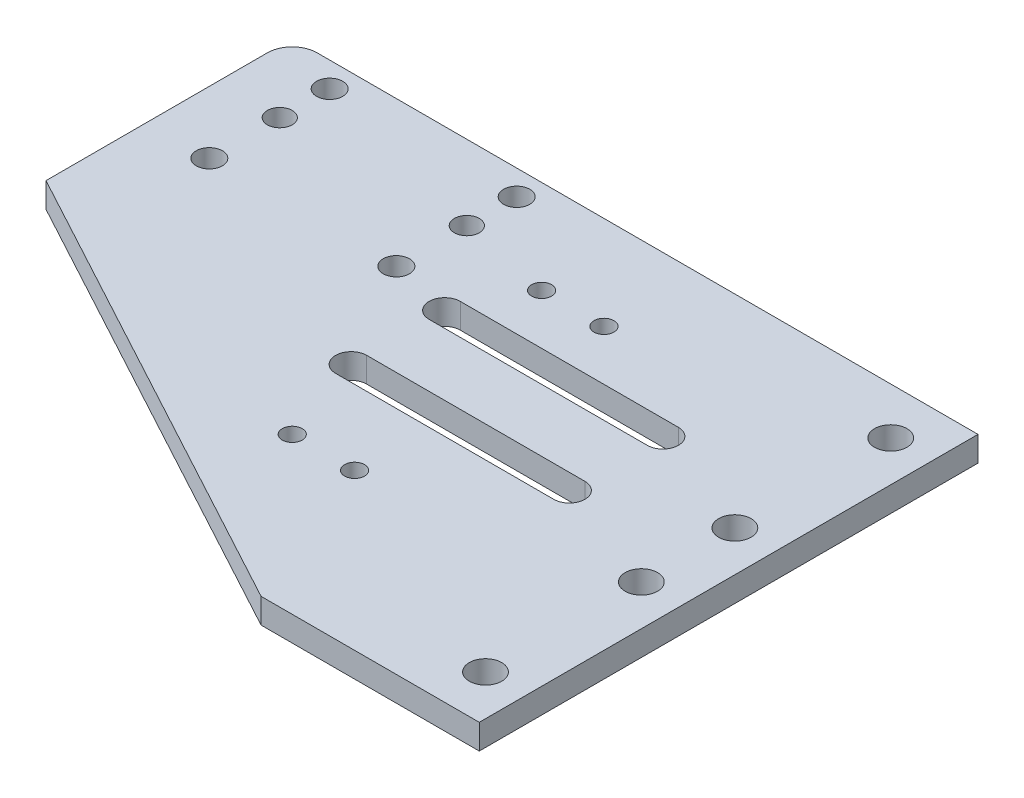
ISO-10303-21;
HEADER;
FILE_DESCRIPTION(('STEP AP214'),'2;1');
FILE_NAME('part.step','',(''),(''),'','','');
FILE_SCHEMA(('AUTOMOTIVE_DESIGN { 1 0 10303 214 1 1 1 1 }'));
ENDSEC;
DATA;
#1=APPLICATION_CONTEXT('core data for automotive mechanical design processes');
#2=APPLICATION_PROTOCOL_DEFINITION('international standard','automotive_design',2000,#1);
#3=PRODUCT_CONTEXT('',#1,'mechanical');
#4=PRODUCT('Part','Part','',(#3));
#5=PRODUCT_RELATED_PRODUCT_CATEGORY('part','',(#4));
#6=PRODUCT_DEFINITION_FORMATION('','',#4);
#7=PRODUCT_DEFINITION_CONTEXT('part definition',#1,'design');
#8=PRODUCT_DEFINITION('design','',#6,#7);
#9=PRODUCT_DEFINITION_SHAPE('','',#8);
#10=(LENGTH_UNIT() NAMED_UNIT(*) SI_UNIT(.MILLI.,.METRE.));
#11=(NAMED_UNIT(*) PLANE_ANGLE_UNIT() SI_UNIT($,.RADIAN.));
#12=(NAMED_UNIT(*) SI_UNIT($,.STERADIAN.) SOLID_ANGLE_UNIT());
#13=UNCERTAINTY_MEASURE_WITH_UNIT(LENGTH_MEASURE(1.E-05),#10,'distance_accuracy_value','');
#14=(GEOMETRIC_REPRESENTATION_CONTEXT(3) GLOBAL_UNCERTAINTY_ASSIGNED_CONTEXT((#13)) GLOBAL_UNIT_ASSIGNED_CONTEXT((#10,
#11,#12)) REPRESENTATION_CONTEXT('',''));
#15=CARTESIAN_POINT('',(0.,0.,0.));
#16=DIRECTION('',(0.,0.,1.));
#17=DIRECTION('',(1.,0.,0.));
#18=AXIS2_PLACEMENT_3D('',#15,#16,#17);
#19=CARTESIAN_POINT('',(0.,4.,0.));
#20=DIRECTION('',(1.,0.,0.));
#21=DIRECTION('',(0.,0.,-1.));
#22=AXIS2_PLACEMENT_3D('',#19,#20,#21);
#23=PLANE('',#22);
#24=DIRECTION('',(0.,0.,1.));
#25=VECTOR('',#24,1.);
#26=CARTESIAN_POINT('',(0.,0.,0.));
#27=LINE('',#26,#25);
#28=CARTESIAN_POINT('',(0.,0.,-76.));
#29=VERTEX_POINT('',#28);
#30=CARTESIAN_POINT('',(0.,0.,-40.5));
#31=VERTEX_POINT('',#30);
#32=EDGE_CURVE('E287',#29,#31,#27,.T.);
#33=ORIENTED_EDGE('',*,*,#32,.T.);
#34=DIRECTION('',(0.,-1.,0.));
#35=VECTOR('',#34,1.);
#36=CARTESIAN_POINT('',(0.,10.,-40.5));
#37=LINE('',#36,#35);
#38=CARTESIAN_POINT('',(0.,4.,-40.5));
#39=VERTEX_POINT('',#38);
#40=EDGE_CURVE('E232',#39,#31,#37,.T.);
#41=ORIENTED_EDGE('',*,*,#40,.F.);
#42=DIRECTION('',(0.,0.,1.));
#43=VECTOR('',#42,1.);
#44=CARTESIAN_POINT('',(0.,4.,0.));
#45=LINE('',#44,#43);
#46=CARTESIAN_POINT('',(0.,4.,-76.));
#47=VERTEX_POINT('',#46);
#48=EDGE_CURVE('E290',#47,#39,#45,.T.);
#49=ORIENTED_EDGE('',*,*,#48,.F.);
#50=DIRECTION('',(0.,-1.,0.));
#51=VECTOR('',#50,1.);
#52=CARTESIAN_POINT('',(0.,4.,-76.));
#53=LINE('',#52,#51);
#54=EDGE_CURVE('E315',#47,#29,#53,.T.);
#55=ORIENTED_EDGE('',*,*,#54,.T.);
#56=EDGE_LOOP('',(#33,#41,#49,#55));
#57=FACE_BOUND('',#56,.T.);
#58=ADVANCED_FACE('F34',(#57),#23,.F.);
#59=CARTESIAN_POINT('',(0.,4.,0.));
#60=DIRECTION('',(0.,0.,-1.));
#61=DIRECTION('',(-1.,0.,0.));
#62=AXIS2_PLACEMENT_3D('',#59,#60,#61);
#63=PLANE('',#62);
#64=DIRECTION('',(1.,0.,0.));
#65=VECTOR('',#64,1.);
#66=CARTESIAN_POINT('',(0.,4.,0.));
#67=LINE('',#66,#65);
#68=CARTESIAN_POINT('',(75.,4.,0.));
#69=VERTEX_POINT('',#68);
#70=CARTESIAN_POINT('',(110.,4.,0.));
#71=VERTEX_POINT('',#70);
#72=EDGE_CURVE('E293',#69,#71,#67,.T.);
#73=ORIENTED_EDGE('',*,*,#72,.F.);
#74=DIRECTION('',(0.,-1.,0.));
#75=VECTOR('',#74,1.);
#76=CARTESIAN_POINT('',(75.,10.,0.));
#77=LINE('',#76,#75);
#78=CARTESIAN_POINT('',(75.,0.,0.));
#79=VERTEX_POINT('',#78);
#80=EDGE_CURVE('E233',#69,#79,#77,.T.);
#81=ORIENTED_EDGE('',*,*,#80,.T.);
#82=DIRECTION('',(1.,0.,0.));
#83=VECTOR('',#82,1.);
#84=CARTESIAN_POINT('',(0.,0.,0.));
#85=LINE('',#84,#83);
#86=CARTESIAN_POINT('',(110.,0.,0.));
#87=VERTEX_POINT('',#86);
#88=EDGE_CURVE('E304',#79,#87,#85,.T.);
#89=ORIENTED_EDGE('',*,*,#88,.T.);
#90=DIRECTION('',(0.,-1.,0.));
#91=VECTOR('',#90,1.);
#92=CARTESIAN_POINT('',(110.,4.,0.));
#93=LINE('',#92,#91);
#94=EDGE_CURVE('E312',#71,#87,#93,.T.);
#95=ORIENTED_EDGE('',*,*,#94,.F.);
#96=EDGE_LOOP('',(#73,#81,#89,#95));
#97=FACE_BOUND('',#96,.T.);
#98=ADVANCED_FACE('F387',(#97),#63,.F.);
#99=CARTESIAN_POINT('',(110.,4.,0.));
#100=DIRECTION('',(-1.,0.,0.));
#101=DIRECTION('',(0.,0.,1.));
#102=AXIS2_PLACEMENT_3D('',#99,#100,#101);
#103=PLANE('',#102);
#104=DIRECTION('',(0.,0.,-1.));
#105=VECTOR('',#104,1.);
#106=CARTESIAN_POINT('',(110.,0.,0.));
#107=LINE('',#106,#105);
#108=CARTESIAN_POINT('',(110.,0.,-80.));
#109=VERTEX_POINT('',#108);
#110=EDGE_CURVE('E306',#87,#109,#107,.T.);
#111=ORIENTED_EDGE('',*,*,#110,.T.);
#112=DIRECTION('',(0.,-1.,0.));
#113=VECTOR('',#112,1.);
#114=CARTESIAN_POINT('',(110.,4.,-80.));
#115=LINE('',#114,#113);
#116=CARTESIAN_POINT('',(110.,4.,-80.));
#117=VERTEX_POINT('',#116);
#118=EDGE_CURVE('E301',#117,#109,#115,.T.);
#119=ORIENTED_EDGE('',*,*,#118,.F.);
#120=DIRECTION('',(0.,0.,-1.));
#121=VECTOR('',#120,1.);
#122=CARTESIAN_POINT('',(110.,4.,0.));
#123=LINE('',#122,#121);
#124=EDGE_CURVE('E296',#71,#117,#123,.T.);
#125=ORIENTED_EDGE('',*,*,#124,.F.);
#126=ORIENTED_EDGE('',*,*,#94,.T.);
#127=EDGE_LOOP('',(#111,#119,#125,#126));
#128=FACE_BOUND('',#127,.T.);
#129=ADVANCED_FACE('F383',(#128),#103,.F.);
#130=CARTESIAN_POINT('',(0.,4.,-80.));
#131=DIRECTION('',(0.,0.,1.));
#132=DIRECTION('',(1.,0.,0.));
#133=AXIS2_PLACEMENT_3D('',#130,#131,#132);
#134=PLANE('',#133);
#135=DIRECTION('',(-1.,0.,0.));
#136=VECTOR('',#135,1.);
#137=CARTESIAN_POINT('',(0.,0.,-80.));
#138=LINE('',#137,#136);
#139=CARTESIAN_POINT('',(4.,0.,-80.));
#140=VERTEX_POINT('',#139);
#141=EDGE_CURVE('E294',#109,#140,#138,.T.);
#142=ORIENTED_EDGE('',*,*,#141,.T.);
#143=DIRECTION('',(0.,-1.,0.));
#144=VECTOR('',#143,1.);
#145=CARTESIAN_POINT('',(4.,4.,-80.));
#146=LINE('',#145,#144);
#147=CARTESIAN_POINT('',(4.,4.,-80.));
#148=VERTEX_POINT('',#147);
#149=EDGE_CURVE('E43',#140,#148,#146,.F.);
#150=ORIENTED_EDGE('',*,*,#149,.T.);
#151=DIRECTION('',(-1.,0.,0.));
#152=VECTOR('',#151,1.);
#153=CARTESIAN_POINT('',(0.,4.,-80.));
#154=LINE('',#153,#152);
#155=EDGE_CURVE('E298',#117,#148,#154,.T.);
#156=ORIENTED_EDGE('',*,*,#155,.F.);
#157=ORIENTED_EDGE('',*,*,#118,.T.);
#158=EDGE_LOOP('',(#142,#150,#156,#157));
#159=FACE_BOUND('',#158,.T.);
#160=ADVANCED_FACE('F362',(#159),#134,.F.);
#161=CARTESIAN_POINT('',(0.,4.,0.));
#162=DIRECTION('',(0.,-1.,0.));
#163=DIRECTION('',(0.,0.,-1.));
#164=AXIS2_PLACEMENT_3D('',#161,#162,#163);
#165=PLANE('',#164);
#166=DIRECTION('',(1.,0.,0.));
#167=VECTOR('',#166,1.);
#168=CARTESIAN_POINT('',(85.,4.,-41.9490859909699));
#169=LINE('',#168,#167);
#170=CARTESIAN_POINT('',(50.,4.,-41.94908599097));
#171=VERTEX_POINT('',#170);
#172=CARTESIAN_POINT('',(85.,4.,-41.9490859909699));
#173=VERTEX_POINT('',#172);
#174=EDGE_CURVE('E148',#171,#173,#169,.T.);
#175=ORIENTED_EDGE('',*,*,#174,.T.);
#176=CARTESIAN_POINT('',(85.,4.,-39.4490859909699));
#177=DIRECTION('',(0.,-1.,0.));
#178=DIRECTION('',(0.,0.,1.));
#179=AXIS2_PLACEMENT_3D('',#176,#177,#178);
#180=CIRCLE('',#179,2.5);
#181=CARTESIAN_POINT('',(85.,4.,-36.9490859909699));
#182=VERTEX_POINT('',#181);
#183=EDGE_CURVE('E140',#173,#182,#180,.T.);
#184=ORIENTED_EDGE('',*,*,#183,.T.);
#185=DIRECTION('',(-1.,0.,0.));
#186=VECTOR('',#185,1.);
#187=CARTESIAN_POINT('',(85.,4.,-36.9490859909699));
#188=LINE('',#187,#186);
#189=CARTESIAN_POINT('',(50.,4.,-36.9490859909699));
#190=VERTEX_POINT('',#189);
#191=EDGE_CURVE('E151',#182,#190,#188,.T.);
#192=ORIENTED_EDGE('',*,*,#191,.T.);
#193=CARTESIAN_POINT('',(50.,4.,-39.44908599097));
#194=DIRECTION('',(0.,-1.,0.));
#195=DIRECTION('',(0.,0.,1.));
#196=AXIS2_PLACEMENT_3D('',#193,#194,#195);
#197=CIRCLE('',#196,2.5);
#198=EDGE_CURVE('E51',#190,#171,#197,.T.);
#199=ORIENTED_EDGE('',*,*,#198,.T.);
#200=EDGE_LOOP('',(#175,#184,#192,#199));
#201=FACE_BOUND('',#200,.T.);
#202=DIRECTION('',(1.,0.,0.));
#203=VECTOR('',#202,1.);
#204=CARTESIAN_POINT('',(85.,4.,-56.9490859909699));
#205=LINE('',#204,#203);
#206=CARTESIAN_POINT('',(50.,4.,-56.9490859909699));
#207=VERTEX_POINT('',#206);
#208=CARTESIAN_POINT('',(85.,4.,-56.9490859909699));
#209=VERTEX_POINT('',#208);
#210=EDGE_CURVE('E186',#207,#209,#205,.T.);
#211=ORIENTED_EDGE('',*,*,#210,.T.);
#212=CARTESIAN_POINT('',(85.,4.,-54.4490859909699));
#213=DIRECTION('',(0.,-1.,0.));
#214=DIRECTION('',(0.,0.,-1.));
#215=AXIS2_PLACEMENT_3D('',#212,#213,#214);
#216=CIRCLE('',#215,2.5);
#217=CARTESIAN_POINT('',(85.,4.,-51.9490859909699));
#218=VERTEX_POINT('',#217);
#219=EDGE_CURVE('E178',#209,#218,#216,.T.);
#220=ORIENTED_EDGE('',*,*,#219,.T.);
#221=DIRECTION('',(-1.,0.,0.));
#222=VECTOR('',#221,1.);
#223=CARTESIAN_POINT('',(85.,4.,-51.9490859909699));
#224=LINE('',#223,#222);
#225=CARTESIAN_POINT('',(50.,4.,-51.9490859909699));
#226=VERTEX_POINT('',#225);
#227=EDGE_CURVE('E181',#218,#226,#224,.T.);
#228=ORIENTED_EDGE('',*,*,#227,.T.);
#229=CARTESIAN_POINT('',(50.,4.,-54.4490859909699));
#230=DIRECTION('',(0.,-1.,0.));
#231=DIRECTION('',(0.,0.,1.));
#232=AXIS2_PLACEMENT_3D('',#229,#230,#231);
#233=CIRCLE('',#232,2.5);
#234=EDGE_CURVE('E59',#226,#207,#233,.T.);
#235=ORIENTED_EDGE('',*,*,#234,.T.);
#236=EDGE_LOOP('',(#211,#220,#228,#235));
#237=FACE_BOUND('',#236,.T.);
#238=CARTESIAN_POINT('',(55.,4.,-25.));
#239=DIRECTION('',(0.,-1.,0.));
#240=DIRECTION('',(0.,0.,-1.));
#241=AXIS2_PLACEMENT_3D('',#238,#239,#240);
#242=CIRCLE('',#241,1.60000000000001);
#243=CARTESIAN_POINT('',(55.,4.,-26.6));
#244=VERTEX_POINT('',#243);
#245=EDGE_CURVE('E215',#244,#244,#242,.F.);
#246=ORIENTED_EDGE('',*,*,#245,.F.);
#247=EDGE_LOOP('',(#246));
#248=FACE_BOUND('',#247,.T.);
#249=CARTESIAN_POINT('',(65.,4.,-25.));
#250=DIRECTION('',(0.,-1.,0.));
#251=DIRECTION('',(0.,0.,-1.));
#252=AXIS2_PLACEMENT_3D('',#249,#250,#251);
#253=CIRCLE('',#252,1.60000000000001);
#254=CARTESIAN_POINT('',(65.,4.,-26.6));
#255=VERTEX_POINT('',#254);
#256=EDGE_CURVE('E210',#255,#255,#253,.F.);
#257=ORIENTED_EDGE('',*,*,#256,.F.);
#258=EDGE_LOOP('',(#257));
#259=FACE_BOUND('',#258,.T.);
#260=CARTESIAN_POINT('',(10.,4.,-68.));
#261=DIRECTION('',(0.,-1.,0.));
#262=DIRECTION('',(0.,0.,-1.));
#263=AXIS2_PLACEMENT_3D('',#260,#261,#262);
#264=CIRCLE('',#263,2.);
#265=CARTESIAN_POINT('',(10.,4.,-70.));
#266=VERTEX_POINT('',#265);
#267=EDGE_CURVE('E222',#266,#266,#264,.F.);
#268=ORIENTED_EDGE('',*,*,#267,.F.);
#269=EDGE_LOOP('',(#268));
#270=FACE_BOUND('',#269,.T.);
#271=CARTESIAN_POINT('',(40.,4.,-68.));
#272=DIRECTION('',(0.,-1.,0.));
#273=DIRECTION('',(0.,0.,-1.));
#274=AXIS2_PLACEMENT_3D('',#271,#272,#273);
#275=CIRCLE('',#274,2.);
#276=CARTESIAN_POINT('',(40.,4.,-70.));
#277=VERTEX_POINT('',#276);
#278=EDGE_CURVE('E223',#277,#277,#275,.F.);
#279=ORIENTED_EDGE('',*,*,#278,.F.);
#280=EDGE_LOOP('',(#279));
#281=FACE_BOUND('',#280,.T.);
#282=CARTESIAN_POINT('',(55.,4.,-65.));
#283=DIRECTION('',(0.,-1.,0.));
#284=DIRECTION('',(0.,0.,-1.));
#285=AXIS2_PLACEMENT_3D('',#282,#283,#284);
#286=CIRCLE('',#285,1.60000000000001);
#287=CARTESIAN_POINT('',(55.,4.,-66.6));
#288=VERTEX_POINT('',#287);
#289=EDGE_CURVE('E249',#288,#288,#286,.T.);
#290=ORIENTED_EDGE('',*,*,#289,.T.);
#291=EDGE_LOOP('',(#290));
#292=FACE_BOUND('',#291,.T.);
#293=CARTESIAN_POINT('',(65.,4.,-65.));
#294=DIRECTION('',(0.,-1.,0.));
#295=DIRECTION('',(0.,0.,-1.));
#296=AXIS2_PLACEMENT_3D('',#293,#294,#295);
#297=CIRCLE('',#296,1.60000000000001);
#298=CARTESIAN_POINT('',(65.,4.,-66.6));
#299=VERTEX_POINT('',#298);
#300=EDGE_CURVE('E244',#299,#299,#297,.T.);
#301=ORIENTED_EDGE('',*,*,#300,.T.);
#302=EDGE_LOOP('',(#301));
#303=FACE_BOUND('',#302,.T.);
#304=CARTESIAN_POINT('',(103.5,4.,-72.5));
#305=DIRECTION('',(0.,1.,0.));
#306=DIRECTION('',(0.,0.,1.));
#307=AXIS2_PLACEMENT_3D('',#304,#305,#306);
#308=CIRCLE('',#307,2.6);
#309=CARTESIAN_POINT('',(103.5,4.,-69.9));
#310=VERTEX_POINT('',#309);
#311=EDGE_CURVE('E256',#310,#310,#308,.T.);
#312=ORIENTED_EDGE('',*,*,#311,.F.);
#313=EDGE_LOOP('',(#312));
#314=FACE_BOUND('',#313,.T.);
#315=CARTESIAN_POINT('',(103.5,4.,-7.49999999999999));
#316=DIRECTION('',(0.,1.,0.));
#317=DIRECTION('',(0.,0.,-1.));
#318=AXIS2_PLACEMENT_3D('',#315,#316,#317);
#319=CIRCLE('',#318,2.6);
#320=CARTESIAN_POINT('',(103.5,4.,-10.1));
#321=VERTEX_POINT('',#320);
#322=EDGE_CURVE('E255',#321,#321,#319,.T.);
#323=ORIENTED_EDGE('',*,*,#322,.F.);
#324=EDGE_LOOP('',(#323));
#325=FACE_BOUND('',#324,.T.);
#326=CARTESIAN_POINT('',(103.5,4.,-32.5));
#327=DIRECTION('',(0.,1.,0.));
#328=DIRECTION('',(0.,0.,-1.));
#329=AXIS2_PLACEMENT_3D('',#326,#327,#328);
#330=CIRCLE('',#329,2.6);
#331=CARTESIAN_POINT('',(103.5,4.,-35.1));
#332=VERTEX_POINT('',#331);
#333=EDGE_CURVE('E252',#332,#332,#330,.T.);
#334=ORIENTED_EDGE('',*,*,#333,.F.);
#335=EDGE_LOOP('',(#334));
#336=FACE_BOUND('',#335,.T.);
#337=CARTESIAN_POINT('',(103.5,4.,-47.5));
#338=DIRECTION('',(0.,1.,0.));
#339=DIRECTION('',(0.,0.,1.));
#340=AXIS2_PLACEMENT_3D('',#337,#338,#339);
#341=CIRCLE('',#340,2.6);
#342=CARTESIAN_POINT('',(103.5,4.,-44.9));
#343=VERTEX_POINT('',#342);
#344=EDGE_CURVE('E259',#343,#343,#341,.T.);
#345=ORIENTED_EDGE('',*,*,#344,.F.);
#346=EDGE_LOOP('',(#345));
#347=FACE_BOUND('',#346,.T.);
#348=CARTESIAN_POINT('',(40.,4.,-56.7));
#349=DIRECTION('',(0.,1.,0.));
#350=DIRECTION('',(0.,0.,-1.));
#351=AXIS2_PLACEMENT_3D('',#348,#349,#350);
#352=CIRCLE('',#351,2.1);
#353=CARTESIAN_POINT('',(40.,4.,-58.8));
#354=VERTEX_POINT('',#353);
#355=EDGE_CURVE('E276',#354,#354,#352,.T.);
#356=ORIENTED_EDGE('',*,*,#355,.F.);
#357=EDGE_LOOP('',(#356));
#358=FACE_BOUND('',#357,.T.);
#359=CARTESIAN_POINT('',(10.,4.,-76.));
#360=DIRECTION('',(0.,1.,0.));
#361=DIRECTION('',(0.,0.,1.));
#362=AXIS2_PLACEMENT_3D('',#359,#360,#361);
#363=CIRCLE('',#362,2.1);
#364=CARTESIAN_POINT('',(10.,4.,-73.9));
#365=VERTEX_POINT('',#364);
#366=EDGE_CURVE('E268',#365,#365,#363,.T.);
#367=ORIENTED_EDGE('',*,*,#366,.F.);
#368=EDGE_LOOP('',(#367));
#369=FACE_BOUND('',#368,.T.);
#370=CARTESIAN_POINT('',(40.,4.,-76.));
#371=DIRECTION('',(0.,1.,0.));
#372=DIRECTION('',(0.,0.,-1.));
#373=AXIS2_PLACEMENT_3D('',#370,#371,#372);
#374=CIRCLE('',#373,2.1);
#375=CARTESIAN_POINT('',(40.,4.,-78.1));
#376=VERTEX_POINT('',#375);
#377=EDGE_CURVE('E269',#376,#376,#374,.T.);
#378=ORIENTED_EDGE('',*,*,#377,.F.);
#379=EDGE_LOOP('',(#378));
#380=FACE_BOUND('',#379,.T.);
#381=CARTESIAN_POINT('',(10.,4.,-56.7));
#382=DIRECTION('',(0.,1.,0.));
#383=DIRECTION('',(0.,0.,1.));
#384=AXIS2_PLACEMENT_3D('',#381,#382,#383);
#385=CIRCLE('',#384,2.1);
#386=CARTESIAN_POINT('',(10.,4.,-54.6));
#387=VERTEX_POINT('',#386);
#388=EDGE_CURVE('E275',#387,#387,#385,.T.);
#389=ORIENTED_EDGE('',*,*,#388,.F.);
#390=EDGE_LOOP('',(#389));
#391=FACE_BOUND('',#390,.T.);
#392=ORIENTED_EDGE('',*,*,#48,.T.);
#393=DIRECTION('',(0.879905397657193,0.,0.475148914734884));
#394=VECTOR('',#393,1.);
#395=CARTESIAN_POINT('',(16.9324868380304,4.,-31.3564571074636));
#396=LINE('',#395,#394);
#397=EDGE_CURVE('E236',#39,#69,#396,.T.);
#398=ORIENTED_EDGE('',*,*,#397,.T.);
#399=ORIENTED_EDGE('',*,*,#72,.T.);
#400=ORIENTED_EDGE('',*,*,#124,.T.);
#401=ORIENTED_EDGE('',*,*,#155,.T.);
#402=CARTESIAN_POINT('',(4.,4.,-76.));
#403=DIRECTION('',(0.,-1.,0.));
#404=DIRECTION('',(0.,0.,-1.));
#405=AXIS2_PLACEMENT_3D('',#402,#403,#404);
#406=CIRCLE('',#405,4.);
#407=EDGE_CURVE('E11',#148,#47,#406,.F.);
#408=ORIENTED_EDGE('',*,*,#407,.T.);
#409=EDGE_LOOP('',(#392,#398,#399,#400,#401,#408));
#410=FACE_BOUND('',#409,.T.);
#411=ADVANCED_FACE('F155',(#201,#237,#248,#259,#270,#281,#292,#303,#314,#325,#336,#347,#358,
#369,#380,#391,#410),#165,.F.);
#412=CARTESIAN_POINT('',(0.,0.,0.));
#413=DIRECTION('',(0.,-1.,0.));
#414=DIRECTION('',(0.,0.,-1.));
#415=AXIS2_PLACEMENT_3D('',#412,#413,#414);
#416=PLANE('',#415);
#417=CARTESIAN_POINT('',(85.,0.,-39.4490859909699));
#418=DIRECTION('',(0.,-1.,0.));
#419=DIRECTION('',(0.,0.,1.));
#420=AXIS2_PLACEMENT_3D('',#417,#418,#419);
#421=CIRCLE('',#420,2.5);
#422=CARTESIAN_POINT('',(85.,0.,-41.9490859909699));
#423=VERTEX_POINT('',#422);
#424=CARTESIAN_POINT('',(85.,0.,-36.9490859909699));
#425=VERTEX_POINT('',#424);
#426=EDGE_CURVE('E143',#423,#425,#421,.T.);
#427=ORIENTED_EDGE('',*,*,#426,.F.);
#428=DIRECTION('',(1.,0.,0.));
#429=VECTOR('',#428,1.);
#430=CARTESIAN_POINT('',(85.,0.,-41.9490859909699));
#431=LINE('',#430,#429);
#432=CARTESIAN_POINT('',(50.,0.,-41.94908599097));
#433=VERTEX_POINT('',#432);
#434=EDGE_CURVE('E158',#433,#423,#431,.T.);
#435=ORIENTED_EDGE('',*,*,#434,.F.);
#436=CARTESIAN_POINT('',(50.,0.,-39.44908599097));
#437=DIRECTION('',(0.,-1.,0.));
#438=DIRECTION('',(0.,0.,1.));
#439=AXIS2_PLACEMENT_3D('',#436,#437,#438);
#440=CIRCLE('',#439,2.5);
#441=CARTESIAN_POINT('',(50.,0.,-36.9490859909699));
#442=VERTEX_POINT('',#441);
#443=EDGE_CURVE('E161',#442,#433,#440,.T.);
#444=ORIENTED_EDGE('',*,*,#443,.F.);
#445=DIRECTION('',(-1.,0.,0.));
#446=VECTOR('',#445,1.);
#447=CARTESIAN_POINT('',(85.,0.,-36.9490859909699));
#448=LINE('',#447,#446);
#449=EDGE_CURVE('E167',#425,#442,#448,.T.);
#450=ORIENTED_EDGE('',*,*,#449,.F.);
#451=EDGE_LOOP('',(#427,#435,#444,#450));
#452=FACE_BOUND('',#451,.T.);
#453=CARTESIAN_POINT('',(85.,0.,-54.4490859909699));
#454=DIRECTION('',(0.,-1.,0.));
#455=DIRECTION('',(0.,0.,-1.));
#456=AXIS2_PLACEMENT_3D('',#453,#454,#455);
#457=CIRCLE('',#456,2.5);
#458=CARTESIAN_POINT('',(85.,0.,-56.9490859909699));
#459=VERTEX_POINT('',#458);
#460=CARTESIAN_POINT('',(85.,0.,-51.9490859909699));
#461=VERTEX_POINT('',#460);
#462=EDGE_CURVE('E190',#459,#461,#457,.T.);
#463=ORIENTED_EDGE('',*,*,#462,.F.);
#464=DIRECTION('',(1.,0.,0.));
#465=VECTOR('',#464,1.);
#466=CARTESIAN_POINT('',(85.,0.,-56.9490859909699));
#467=LINE('',#466,#465);
#468=CARTESIAN_POINT('',(50.,0.,-56.9490859909699));
#469=VERTEX_POINT('',#468);
#470=EDGE_CURVE('E182',#469,#459,#467,.T.);
#471=ORIENTED_EDGE('',*,*,#470,.F.);
#472=CARTESIAN_POINT('',(50.,0.,-54.4490859909699));
#473=DIRECTION('',(0.,-1.,0.));
#474=DIRECTION('',(0.,0.,1.));
#475=AXIS2_PLACEMENT_3D('',#472,#473,#474);
#476=CIRCLE('',#475,2.5);
#477=CARTESIAN_POINT('',(50.,0.,-51.9490859909699));
#478=VERTEX_POINT('',#477);
#479=EDGE_CURVE('E195',#478,#469,#476,.T.);
#480=ORIENTED_EDGE('',*,*,#479,.F.);
#481=DIRECTION('',(-1.,0.,0.));
#482=VECTOR('',#481,1.);
#483=CARTESIAN_POINT('',(85.,0.,-51.9490859909699));
#484=LINE('',#483,#482);
#485=EDGE_CURVE('E192',#461,#478,#484,.T.);
#486=ORIENTED_EDGE('',*,*,#485,.F.);
#487=EDGE_LOOP('',(#463,#471,#480,#486));
#488=FACE_BOUND('',#487,.T.);
#489=CARTESIAN_POINT('',(55.,0.,-25.));
#490=DIRECTION('',(0.,1.,0.));
#491=DIRECTION('',(0.,0.,1.));
#492=AXIS2_PLACEMENT_3D('',#489,#490,#491);
#493=CIRCLE('',#492,1.60000000000001);
#494=CARTESIAN_POINT('',(55.,0.,-23.4));
#495=VERTEX_POINT('',#494);
#496=EDGE_CURVE('E207',#495,#495,#493,.T.);
#497=ORIENTED_EDGE('',*,*,#496,.T.);
#498=EDGE_LOOP('',(#497));
#499=FACE_BOUND('',#498,.T.);
#500=CARTESIAN_POINT('',(65.,0.,-25.));
#501=DIRECTION('',(0.,1.,0.));
#502=DIRECTION('',(0.,0.,1.));
#503=AXIS2_PLACEMENT_3D('',#500,#501,#502);
#504=CIRCLE('',#503,1.60000000000001);
#505=CARTESIAN_POINT('',(65.,0.,-23.4));
#506=VERTEX_POINT('',#505);
#507=EDGE_CURVE('E174',#506,#506,#504,.T.);
#508=ORIENTED_EDGE('',*,*,#507,.T.);
#509=EDGE_LOOP('',(#508));
#510=FACE_BOUND('',#509,.T.);
#511=CARTESIAN_POINT('',(10.,0.,-68.));
#512=DIRECTION('',(0.,-1.,0.));
#513=DIRECTION('',(0.,0.,-1.));
#514=AXIS2_PLACEMENT_3D('',#511,#512,#513);
#515=CIRCLE('',#514,2.);
#516=CARTESIAN_POINT('',(10.,0.,-70.));
#517=VERTEX_POINT('',#516);
#518=EDGE_CURVE('E219',#517,#517,#515,.T.);
#519=ORIENTED_EDGE('',*,*,#518,.F.);
#520=EDGE_LOOP('',(#519));
#521=FACE_BOUND('',#520,.T.);
#522=CARTESIAN_POINT('',(40.,0.,-68.));
#523=DIRECTION('',(0.,-1.,0.));
#524=DIRECTION('',(0.,0.,-1.));
#525=AXIS2_PLACEMENT_3D('',#522,#523,#524);
#526=CIRCLE('',#525,2.);
#527=CARTESIAN_POINT('',(40.,0.,-70.));
#528=VERTEX_POINT('',#527);
#529=EDGE_CURVE('E218',#528,#528,#526,.T.);
#530=ORIENTED_EDGE('',*,*,#529,.F.);
#531=EDGE_LOOP('',(#530));
#532=FACE_BOUND('',#531,.T.);
#533=DIRECTION('',(0.879905397657192,0.,0.475148914734884));
#534=VECTOR('',#533,1.);
#535=CARTESIAN_POINT('',(0.,0.,-40.5));
#536=LINE('',#535,#534);
#537=EDGE_CURVE('E226',#31,#79,#536,.T.);
#538=ORIENTED_EDGE('',*,*,#537,.F.);
#539=ORIENTED_EDGE('',*,*,#32,.F.);
#540=CARTESIAN_POINT('',(4.,0.,-76.));
#541=DIRECTION('',(0.,-1.,0.));
#542=DIRECTION('',(0.,0.,-1.));
#543=AXIS2_PLACEMENT_3D('',#540,#541,#542);
#544=CIRCLE('',#543,4.);
#545=EDGE_CURVE('E318',#29,#140,#544,.T.);
#546=ORIENTED_EDGE('',*,*,#545,.T.);
#547=ORIENTED_EDGE('',*,*,#141,.F.);
#548=ORIENTED_EDGE('',*,*,#110,.F.);
#549=ORIENTED_EDGE('',*,*,#88,.F.);
#550=EDGE_LOOP('',(#538,#539,#546,#547,#548,#549));
#551=FACE_BOUND('',#550,.T.);
#552=CARTESIAN_POINT('',(55.,0.,-65.));
#553=DIRECTION('',(0.,-1.,0.));
#554=DIRECTION('',(0.,0.,-1.));
#555=AXIS2_PLACEMENT_3D('',#552,#553,#554);
#556=CIRCLE('',#555,1.60000000000001);
#557=CARTESIAN_POINT('',(55.,0.,-66.6));
#558=VERTEX_POINT('',#557);
#559=EDGE_CURVE('E241',#558,#558,#556,.T.);
#560=ORIENTED_EDGE('',*,*,#559,.F.);
#561=EDGE_LOOP('',(#560));
#562=FACE_BOUND('',#561,.T.);
#563=CARTESIAN_POINT('',(65.,0.,-65.));
#564=DIRECTION('',(0.,-1.,0.));
#565=DIRECTION('',(0.,0.,-1.));
#566=AXIS2_PLACEMENT_3D('',#563,#564,#565);
#567=CIRCLE('',#566,1.60000000000001);
#568=CARTESIAN_POINT('',(65.,0.,-66.6));
#569=VERTEX_POINT('',#568);
#570=EDGE_CURVE('E240',#569,#569,#567,.T.);
#571=ORIENTED_EDGE('',*,*,#570,.F.);
#572=EDGE_LOOP('',(#571));
#573=FACE_BOUND('',#572,.T.);
#574=CARTESIAN_POINT('',(103.5,0.,-72.5));
#575=DIRECTION('',(0.,-1.,0.));
#576=DIRECTION('',(0.,0.,-1.));
#577=AXIS2_PLACEMENT_3D('',#574,#575,#576);
#578=CIRCLE('',#577,2.6);
#579=CARTESIAN_POINT('',(103.5,0.,-75.1));
#580=VERTEX_POINT('',#579);
#581=EDGE_CURVE('E38',#580,#580,#578,.T.);
#582=ORIENTED_EDGE('',*,*,#581,.F.);
#583=EDGE_LOOP('',(#582));
#584=FACE_BOUND('',#583,.T.);
#585=CARTESIAN_POINT('',(103.5,0.,-7.49999999999999));
#586=DIRECTION('',(0.,-1.,0.));
#587=DIRECTION('',(0.,0.,-1.));
#588=AXIS2_PLACEMENT_3D('',#585,#586,#587);
#589=CIRCLE('',#588,2.6);
#590=CARTESIAN_POINT('',(103.5,0.,-10.1));
#591=VERTEX_POINT('',#590);
#592=EDGE_CURVE('E325',#591,#591,#589,.T.);
#593=ORIENTED_EDGE('',*,*,#592,.F.);
#594=EDGE_LOOP('',(#593));
#595=FACE_BOUND('',#594,.T.);
#596=CARTESIAN_POINT('',(103.5,0.,-32.5));
#597=DIRECTION('',(0.,-1.,0.));
#598=DIRECTION('',(0.,0.,-1.));
#599=AXIS2_PLACEMENT_3D('',#596,#597,#598);
#600=CIRCLE('',#599,2.6);
#601=CARTESIAN_POINT('',(103.5,0.,-35.1));
#602=VERTEX_POINT('',#601);
#603=EDGE_CURVE('E323',#602,#602,#600,.T.);
#604=ORIENTED_EDGE('',*,*,#603,.F.);
#605=EDGE_LOOP('',(#604));
#606=FACE_BOUND('',#605,.T.);
#607=CARTESIAN_POINT('',(103.5,0.,-47.5));
#608=DIRECTION('',(0.,-1.,0.));
#609=DIRECTION('',(0.,0.,-1.));
#610=AXIS2_PLACEMENT_3D('',#607,#608,#609);
#611=CIRCLE('',#610,2.6);
#612=CARTESIAN_POINT('',(103.5,0.,-50.1));
#613=VERTEX_POINT('',#612);
#614=EDGE_CURVE('E264',#613,#613,#611,.T.);
#615=ORIENTED_EDGE('',*,*,#614,.F.);
#616=EDGE_LOOP('',(#615));
#617=FACE_BOUND('',#616,.T.);
#618=CARTESIAN_POINT('',(40.,0.,-56.7));
#619=DIRECTION('',(0.,1.,0.));
#620=DIRECTION('',(0.,0.,-1.));
#621=AXIS2_PLACEMENT_3D('',#618,#619,#620);
#622=CIRCLE('',#621,2.1);
#623=CARTESIAN_POINT('',(40.,0.,-58.8));
#624=VERTEX_POINT('',#623);
#625=EDGE_CURVE('E272',#624,#624,#622,.T.);
#626=ORIENTED_EDGE('',*,*,#625,.T.);
#627=EDGE_LOOP('',(#626));
#628=FACE_BOUND('',#627,.T.);
#629=CARTESIAN_POINT('',(10.,0.,-76.));
#630=DIRECTION('',(0.,1.,0.));
#631=DIRECTION('',(0.,0.,1.));
#632=AXIS2_PLACEMENT_3D('',#629,#630,#631);
#633=CIRCLE('',#632,2.1);
#634=CARTESIAN_POINT('',(10.,0.,-73.9));
#635=VERTEX_POINT('',#634);
#636=EDGE_CURVE('E279',#635,#635,#633,.T.);
#637=ORIENTED_EDGE('',*,*,#636,.T.);
#638=EDGE_LOOP('',(#637));
#639=FACE_BOUND('',#638,.T.);
#640=CARTESIAN_POINT('',(40.,0.,-76.));
#641=DIRECTION('',(0.,1.,0.));
#642=DIRECTION('',(0.,0.,-1.));
#643=AXIS2_PLACEMENT_3D('',#640,#641,#642);
#644=CIRCLE('',#643,2.1);
#645=CARTESIAN_POINT('',(40.,0.,-78.1));
#646=VERTEX_POINT('',#645);
#647=EDGE_CURVE('E265',#646,#646,#644,.T.);
#648=ORIENTED_EDGE('',*,*,#647,.T.);
#649=EDGE_LOOP('',(#648));
#650=FACE_BOUND('',#649,.T.);
#651=CARTESIAN_POINT('',(10.,0.,-56.7));
#652=DIRECTION('',(0.,1.,0.));
#653=DIRECTION('',(0.,0.,1.));
#654=AXIS2_PLACEMENT_3D('',#651,#652,#653);
#655=CIRCLE('',#654,2.1);
#656=CARTESIAN_POINT('',(10.,0.,-54.6));
#657=VERTEX_POINT('',#656);
#658=EDGE_CURVE('E284',#657,#657,#655,.T.);
#659=ORIENTED_EDGE('',*,*,#658,.T.);
#660=EDGE_LOOP('',(#659));
#661=FACE_BOUND('',#660,.T.);
#662=ADVANCED_FACE('F335',(#452,#488,#499,#510,#521,#532,#551,#562,#573,#584,#595,#606,#617,
#628,#639,#650,#661),#416,.T.);
#663=CARTESIAN_POINT('',(10.,0.,-56.7));
#664=DIRECTION('',(0.,1.,0.));
#665=DIRECTION('',(0.,0.,1.));
#666=AXIS2_PLACEMENT_3D('',#663,#664,#665);
#667=CYLINDRICAL_SURFACE('',#666,2.1);
#668=ORIENTED_EDGE('',*,*,#658,.F.);
#669=EDGE_LOOP('',(#668));
#670=FACE_BOUND('',#669,.T.);
#671=ORIENTED_EDGE('',*,*,#388,.T.);
#672=EDGE_LOOP('',(#671));
#673=FACE_BOUND('',#672,.T.);
#674=ADVANCED_FACE('F338',(#670,#673),#667,.F.);
#675=CARTESIAN_POINT('',(40.,0.,-76.));
#676=DIRECTION('',(0.,1.,0.));
#677=DIRECTION('',(0.,0.,1.));
#678=AXIS2_PLACEMENT_3D('',#675,#676,#677);
#679=CYLINDRICAL_SURFACE('',#678,2.1);
#680=ORIENTED_EDGE('',*,*,#647,.F.);
#681=EDGE_LOOP('',(#680));
#682=FACE_BOUND('',#681,.T.);
#683=ORIENTED_EDGE('',*,*,#377,.T.);
#684=EDGE_LOOP('',(#683));
#685=FACE_BOUND('',#684,.T.);
#686=ADVANCED_FACE('F356',(#682,#685),#679,.F.);
#687=CARTESIAN_POINT('',(10.,0.,-76.));
#688=DIRECTION('',(0.,1.,0.));
#689=DIRECTION('',(0.,0.,1.));
#690=AXIS2_PLACEMENT_3D('',#687,#688,#689);
#691=CYLINDRICAL_SURFACE('',#690,2.1);
#692=ORIENTED_EDGE('',*,*,#636,.F.);
#693=EDGE_LOOP('',(#692));
#694=FACE_BOUND('',#693,.T.);
#695=ORIENTED_EDGE('',*,*,#366,.T.);
#696=EDGE_LOOP('',(#695));
#697=FACE_BOUND('',#696,.T.);
#698=ADVANCED_FACE('F414',(#694,#697),#691,.F.);
#699=CARTESIAN_POINT('',(40.,0.,-56.7));
#700=DIRECTION('',(0.,1.,0.));
#701=DIRECTION('',(0.,0.,1.));
#702=AXIS2_PLACEMENT_3D('',#699,#700,#701);
#703=CYLINDRICAL_SURFACE('',#702,2.1);
#704=ORIENTED_EDGE('',*,*,#625,.F.);
#705=EDGE_LOOP('',(#704));
#706=FACE_BOUND('',#705,.T.);
#707=ORIENTED_EDGE('',*,*,#355,.T.);
#708=EDGE_LOOP('',(#707));
#709=FACE_BOUND('',#708,.T.);
#710=ADVANCED_FACE('F417',(#706,#709),#703,.F.);
#711=CARTESIAN_POINT('',(4.,4.,-76.));
#712=DIRECTION('',(0.,-1.,0.));
#713=DIRECTION('',(0.,0.,-1.));
#714=AXIS2_PLACEMENT_3D('',#711,#712,#713);
#715=CYLINDRICAL_SURFACE('',#714,4.);
#716=ORIENTED_EDGE('',*,*,#407,.F.);
#717=ORIENTED_EDGE('',*,*,#149,.F.);
#718=ORIENTED_EDGE('',*,*,#545,.F.);
#719=ORIENTED_EDGE('',*,*,#54,.F.);
#720=EDGE_LOOP('',(#716,#717,#718,#719));
#721=FACE_BOUND('',#720,.T.);
#722=ADVANCED_FACE('F36',(#721),#715,.T.);
#723=CARTESIAN_POINT('',(103.5,-6.,-47.5));
#724=DIRECTION('',(0.,1.,0.));
#725=DIRECTION('',(0.,0.,1.));
#726=AXIS2_PLACEMENT_3D('',#723,#724,#725);
#727=CYLINDRICAL_SURFACE('',#726,2.6);
#728=ORIENTED_EDGE('',*,*,#614,.T.);
#729=EDGE_LOOP('',(#728));
#730=FACE_BOUND('',#729,.T.);
#731=ORIENTED_EDGE('',*,*,#344,.T.);
#732=EDGE_LOOP('',(#731));
#733=FACE_BOUND('',#732,.T.);
#734=ADVANCED_FACE('F425',(#730,#733),#727,.F.);
#735=CARTESIAN_POINT('',(103.5,-6.,-32.5));
#736=DIRECTION('',(0.,1.,0.));
#737=DIRECTION('',(0.,0.,1.));
#738=AXIS2_PLACEMENT_3D('',#735,#736,#737);
#739=CYLINDRICAL_SURFACE('',#738,2.6);
#740=ORIENTED_EDGE('',*,*,#603,.T.);
#741=EDGE_LOOP('',(#740));
#742=FACE_BOUND('',#741,.T.);
#743=ORIENTED_EDGE('',*,*,#333,.T.);
#744=EDGE_LOOP('',(#743));
#745=FACE_BOUND('',#744,.T.);
#746=ADVANCED_FACE('F428',(#742,#745),#739,.F.);
#747=CARTESIAN_POINT('',(103.5,-6.,-7.49999999999999));
#748=DIRECTION('',(0.,1.,0.));
#749=DIRECTION('',(0.,0.,1.));
#750=AXIS2_PLACEMENT_3D('',#747,#748,#749);
#751=CYLINDRICAL_SURFACE('',#750,2.6);
#752=ORIENTED_EDGE('',*,*,#592,.T.);
#753=EDGE_LOOP('',(#752));
#754=FACE_BOUND('',#753,.T.);
#755=ORIENTED_EDGE('',*,*,#322,.T.);
#756=EDGE_LOOP('',(#755));
#757=FACE_BOUND('',#756,.T.);
#758=ADVANCED_FACE('F430',(#754,#757),#751,.F.);
#759=CARTESIAN_POINT('',(103.5,-6.,-72.5));
#760=DIRECTION('',(0.,1.,0.));
#761=DIRECTION('',(0.,0.,1.));
#762=AXIS2_PLACEMENT_3D('',#759,#760,#761);
#763=CYLINDRICAL_SURFACE('',#762,2.6);
#764=ORIENTED_EDGE('',*,*,#581,.T.);
#765=EDGE_LOOP('',(#764));
#766=FACE_BOUND('',#765,.T.);
#767=ORIENTED_EDGE('',*,*,#311,.T.);
#768=EDGE_LOOP('',(#767));
#769=FACE_BOUND('',#768,.T.);
#770=ADVANCED_FACE('F332',(#766,#769),#763,.F.);
#771=CARTESIAN_POINT('',(65.,10.,-65.));
#772=DIRECTION('',(0.,-1.,0.));
#773=DIRECTION('',(0.,0.,-1.));
#774=AXIS2_PLACEMENT_3D('',#771,#772,#773);
#775=CYLINDRICAL_SURFACE('',#774,1.60000000000001);
#776=ORIENTED_EDGE('',*,*,#570,.T.);
#777=EDGE_LOOP('',(#776));
#778=FACE_BOUND('',#777,.T.);
#779=ORIENTED_EDGE('',*,*,#300,.F.);
#780=EDGE_LOOP('',(#779));
#781=FACE_BOUND('',#780,.T.);
#782=ADVANCED_FACE('F401',(#778,#781),#775,.F.);
#783=CARTESIAN_POINT('',(55.,10.,-65.));
#784=DIRECTION('',(0.,-1.,0.));
#785=DIRECTION('',(0.,0.,-1.));
#786=AXIS2_PLACEMENT_3D('',#783,#784,#785);
#787=CYLINDRICAL_SURFACE('',#786,1.60000000000001);
#788=ORIENTED_EDGE('',*,*,#559,.T.);
#789=EDGE_LOOP('',(#788));
#790=FACE_BOUND('',#789,.T.);
#791=ORIENTED_EDGE('',*,*,#289,.F.);
#792=EDGE_LOOP('',(#791));
#793=FACE_BOUND('',#792,.T.);
#794=ADVANCED_FACE('F392',(#790,#793),#787,.F.);
#795=CARTESIAN_POINT('',(0.,10.,-40.5));
#796=DIRECTION('',(0.475148914734884,0.,-0.879905397657193));
#797=DIRECTION('',(-0.879905397657193,0.,-0.475148914734884));
#798=AXIS2_PLACEMENT_3D('',#795,#796,#797);
#799=PLANE('',#798);
#800=ORIENTED_EDGE('',*,*,#40,.T.);
#801=ORIENTED_EDGE('',*,*,#537,.T.);
#802=ORIENTED_EDGE('',*,*,#80,.F.);
#803=ORIENTED_EDGE('',*,*,#397,.F.);
#804=EDGE_LOOP('',(#800,#801,#802,#803));
#805=FACE_BOUND('',#804,.T.);
#806=ADVANCED_FACE('F389',(#805),#799,.F.);
#807=CARTESIAN_POINT('',(40.,4.001,-68.));
#808=DIRECTION('',(0.,-1.,0.));
#809=DIRECTION('',(0.,0.,-1.));
#810=AXIS2_PLACEMENT_3D('',#807,#808,#809);
#811=CYLINDRICAL_SURFACE('',#810,2.);
#812=ORIENTED_EDGE('',*,*,#529,.T.);
#813=EDGE_LOOP('',(#812));
#814=FACE_BOUND('',#813,.T.);
#815=ORIENTED_EDGE('',*,*,#278,.T.);
#816=EDGE_LOOP('',(#815));
#817=FACE_BOUND('',#816,.T.);
#818=ADVANCED_FACE('F391',(#814,#817),#811,.F.);
#819=CARTESIAN_POINT('',(10.,4.001,-68.));
#820=DIRECTION('',(0.,-1.,0.));
#821=DIRECTION('',(0.,0.,-1.));
#822=AXIS2_PLACEMENT_3D('',#819,#820,#821);
#823=CYLINDRICAL_SURFACE('',#822,2.);
#824=ORIENTED_EDGE('',*,*,#518,.T.);
#825=EDGE_LOOP('',(#824));
#826=FACE_BOUND('',#825,.T.);
#827=ORIENTED_EDGE('',*,*,#267,.T.);
#828=EDGE_LOOP('',(#827));
#829=FACE_BOUND('',#828,.T.);
#830=ADVANCED_FACE('F398',(#826,#829),#823,.F.);
#831=CARTESIAN_POINT('',(65.,10.,-25.));
#832=DIRECTION('',(0.,-1.,0.));
#833=DIRECTION('',(0.,0.,-1.));
#834=AXIS2_PLACEMENT_3D('',#831,#832,#833);
#835=CYLINDRICAL_SURFACE('',#834,1.60000000000001);
#836=ORIENTED_EDGE('',*,*,#507,.F.);
#837=EDGE_LOOP('',(#836));
#838=FACE_BOUND('',#837,.T.);
#839=ORIENTED_EDGE('',*,*,#256,.T.);
#840=EDGE_LOOP('',(#839));
#841=FACE_BOUND('',#840,.T.);
#842=ADVANCED_FACE('F503',(#838,#841),#835,.F.);
#843=CARTESIAN_POINT('',(55.,10.,-25.));
#844=DIRECTION('',(0.,-1.,0.));
#845=DIRECTION('',(0.,0.,-1.));
#846=AXIS2_PLACEMENT_3D('',#843,#844,#845);
#847=CYLINDRICAL_SURFACE('',#846,1.60000000000001);
#848=ORIENTED_EDGE('',*,*,#496,.F.);
#849=EDGE_LOOP('',(#848));
#850=FACE_BOUND('',#849,.T.);
#851=ORIENTED_EDGE('',*,*,#245,.T.);
#852=EDGE_LOOP('',(#851));
#853=FACE_BOUND('',#852,.T.);
#854=ADVANCED_FACE('F513',(#850,#853),#847,.F.);
#855=CARTESIAN_POINT('',(85.,4.,-54.4490859909699));
#856=DIRECTION('',(0.,-1.,0.));
#857=DIRECTION('',(0.,0.,-1.));
#858=AXIS2_PLACEMENT_3D('',#855,#856,#857);
#859=CYLINDRICAL_SURFACE('',#858,2.5);
#860=ORIENTED_EDGE('',*,*,#462,.T.);
#861=DIRECTION('',(0.,-1.,0.));
#862=VECTOR('',#861,1.);
#863=CARTESIAN_POINT('',(85.,4.,-51.9490859909699));
#864=LINE('',#863,#862);
#865=EDGE_CURVE('E189',#218,#461,#864,.T.);
#866=ORIENTED_EDGE('',*,*,#865,.F.);
#867=ORIENTED_EDGE('',*,*,#219,.F.);
#868=DIRECTION('',(0.,-1.,0.));
#869=VECTOR('',#868,1.);
#870=CARTESIAN_POINT('',(85.,4.,-56.9490859909699));
#871=LINE('',#870,#869);
#872=EDGE_CURVE('E168',#209,#459,#871,.T.);
#873=ORIENTED_EDGE('',*,*,#872,.T.);
#874=EDGE_LOOP('',(#860,#866,#867,#873));
#875=FACE_BOUND('',#874,.T.);
#876=ADVANCED_FACE('F523',(#875),#859,.F.);
#877=CARTESIAN_POINT('',(85.,4.,-56.9490859909699));
#878=DIRECTION('',(0.,0.,-1.));
#879=DIRECTION('',(-1.,0.,0.));
#880=AXIS2_PLACEMENT_3D('',#877,#878,#879);
#881=PLANE('',#880);
#882=ORIENTED_EDGE('',*,*,#470,.T.);
#883=ORIENTED_EDGE('',*,*,#872,.F.);
#884=ORIENTED_EDGE('',*,*,#210,.F.);
#885=DIRECTION('',(0.,-1.,0.));
#886=VECTOR('',#885,1.);
#887=CARTESIAN_POINT('',(50.,4.,-56.9490859909699));
#888=LINE('',#887,#886);
#889=EDGE_CURVE('E201',#207,#469,#888,.T.);
#890=ORIENTED_EDGE('',*,*,#889,.T.);
#891=EDGE_LOOP('',(#882,#883,#884,#890));
#892=FACE_BOUND('',#891,.T.);
#893=ADVANCED_FACE('F547',(#892),#881,.F.);
#894=CARTESIAN_POINT('',(50.,4.,-54.4490859909699));
#895=DIRECTION('',(0.,-1.,0.));
#896=DIRECTION('',(0.,0.,-1.));
#897=AXIS2_PLACEMENT_3D('',#894,#895,#896);
#898=CYLINDRICAL_SURFACE('',#897,2.5);
#899=ORIENTED_EDGE('',*,*,#479,.T.);
#900=ORIENTED_EDGE('',*,*,#889,.F.);
#901=ORIENTED_EDGE('',*,*,#234,.F.);
#902=DIRECTION('',(0.,-1.,0.));
#903=VECTOR('',#902,1.);
#904=CARTESIAN_POINT('',(50.,4.,-51.9490859909699));
#905=LINE('',#904,#903);
#906=EDGE_CURVE('E203',#226,#478,#905,.T.);
#907=ORIENTED_EDGE('',*,*,#906,.T.);
#908=EDGE_LOOP('',(#899,#900,#901,#907));
#909=FACE_BOUND('',#908,.T.);
#910=ADVANCED_FACE('F557',(#909),#898,.F.);
#911=CARTESIAN_POINT('',(85.,4.,-51.9490859909699));
#912=DIRECTION('',(0.,0.,1.));
#913=DIRECTION('',(1.,0.,0.));
#914=AXIS2_PLACEMENT_3D('',#911,#912,#913);
#915=PLANE('',#914);
#916=ORIENTED_EDGE('',*,*,#485,.T.);
#917=ORIENTED_EDGE('',*,*,#906,.F.);
#918=ORIENTED_EDGE('',*,*,#227,.F.);
#919=ORIENTED_EDGE('',*,*,#865,.T.);
#920=EDGE_LOOP('',(#916,#917,#918,#919));
#921=FACE_BOUND('',#920,.T.);
#922=ADVANCED_FACE('F567',(#921),#915,.F.);
#923=CARTESIAN_POINT('',(85.,4.,-39.4490859909699));
#924=DIRECTION('',(0.,-1.,0.));
#925=DIRECTION('',(0.,0.,-1.));
#926=AXIS2_PLACEMENT_3D('',#923,#924,#925);
#927=CYLINDRICAL_SURFACE('',#926,2.5);
#928=ORIENTED_EDGE('',*,*,#426,.T.);
#929=DIRECTION('',(0.,-1.,0.));
#930=VECTOR('',#929,1.);
#931=CARTESIAN_POINT('',(85.,4.,-36.9490859909699));
#932=LINE('',#931,#930);
#933=EDGE_CURVE('E136',#182,#425,#932,.T.);
#934=ORIENTED_EDGE('',*,*,#933,.F.);
#935=ORIENTED_EDGE('',*,*,#183,.F.);
#936=DIRECTION('',(0.,-1.,0.));
#937=VECTOR('',#936,1.);
#938=CARTESIAN_POINT('',(85.,4.,-41.9490859909699));
#939=LINE('',#938,#937);
#940=EDGE_CURVE('E172',#173,#423,#939,.T.);
#941=ORIENTED_EDGE('',*,*,#940,.T.);
#942=EDGE_LOOP('',(#928,#934,#935,#941));
#943=FACE_BOUND('',#942,.T.);
#944=ADVANCED_FACE('F138',(#943),#927,.F.);
#945=CARTESIAN_POINT('',(85.,4.,-41.9490859909699));
#946=DIRECTION('',(0.,0.,-1.));
#947=DIRECTION('',(-1.,0.,0.));
#948=AXIS2_PLACEMENT_3D('',#945,#946,#947);
#949=PLANE('',#948);
#950=ORIENTED_EDGE('',*,*,#434,.T.);
#951=ORIENTED_EDGE('',*,*,#940,.F.);
#952=ORIENTED_EDGE('',*,*,#174,.F.);
#953=DIRECTION('',(0.,-1.,0.));
#954=VECTOR('',#953,1.);
#955=CARTESIAN_POINT('',(50.,4.,-41.94908599097));
#956=LINE('',#955,#954);
#957=EDGE_CURVE('E175',#171,#433,#956,.T.);
#958=ORIENTED_EDGE('',*,*,#957,.T.);
#959=EDGE_LOOP('',(#950,#951,#952,#958));
#960=FACE_BOUND('',#959,.T.);
#961=ADVANCED_FACE('F585',(#960),#949,.F.);
#962=CARTESIAN_POINT('',(50.,4.,-39.44908599097));
#963=DIRECTION('',(0.,-1.,0.));
#964=DIRECTION('',(0.,0.,-1.));
#965=AXIS2_PLACEMENT_3D('',#962,#963,#964);
#966=CYLINDRICAL_SURFACE('',#965,2.5);
#967=ORIENTED_EDGE('',*,*,#443,.T.);
#968=ORIENTED_EDGE('',*,*,#957,.F.);
#969=ORIENTED_EDGE('',*,*,#198,.F.);
#970=DIRECTION('',(0.,-1.,0.));
#971=VECTOR('',#970,1.);
#972=CARTESIAN_POINT('',(50.,4.,-36.9490859909699));
#973=LINE('',#972,#971);
#974=EDGE_CURVE('E147',#190,#442,#973,.T.);
#975=ORIENTED_EDGE('',*,*,#974,.T.);
#976=EDGE_LOOP('',(#967,#968,#969,#975));
#977=FACE_BOUND('',#976,.T.);
#978=ADVANCED_FACE('F594',(#977),#966,.F.);
#979=CARTESIAN_POINT('',(85.,4.,-36.9490859909699));
#980=DIRECTION('',(0.,0.,1.));
#981=DIRECTION('',(1.,0.,0.));
#982=AXIS2_PLACEMENT_3D('',#979,#980,#981);
#983=PLANE('',#982);
#984=ORIENTED_EDGE('',*,*,#449,.T.);
#985=ORIENTED_EDGE('',*,*,#974,.F.);
#986=ORIENTED_EDGE('',*,*,#191,.F.);
#987=ORIENTED_EDGE('',*,*,#933,.T.);
#988=EDGE_LOOP('',(#984,#985,#986,#987));
#989=FACE_BOUND('',#988,.T.);
#990=ADVANCED_FACE('F152',(#989),#983,.F.);
#991=CLOSED_SHELL('',(#58,#98,#129,#160,#411,#662,#674,#686,#698,#710,#722,#734,#746,#758,#770,
#782,#794,#806,#818,#830,#842,#854,#876,#893,#910,#922,#944,#961,#978,#990));
#992=MANIFOLD_SOLID_BREP('B2',#991);
#993=ADVANCED_BREP_SHAPE_REPRESENTATION('',(#18,#992),#14);
#994=SHAPE_DEFINITION_REPRESENTATION(#9,#993);
ENDSEC;
END-ISO-10303-21;
